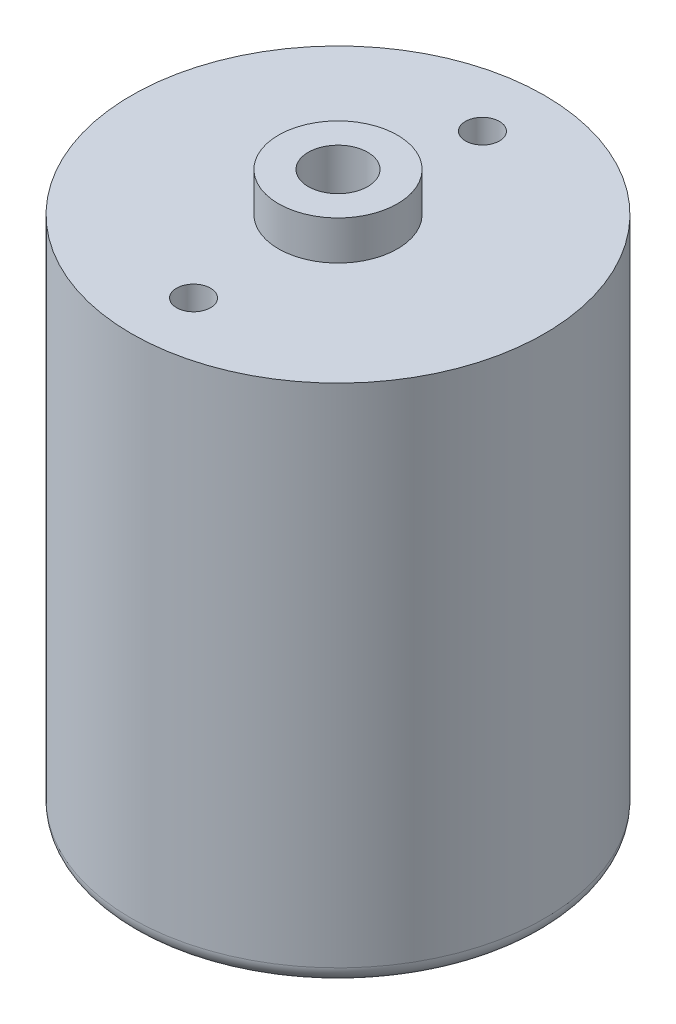
ISO-10303-21;
HEADER;
FILE_DESCRIPTION(('STEP AP214'),'2;1');
FILE_NAME('part.step','',(''),(''),'','','');
FILE_SCHEMA(('AUTOMOTIVE_DESIGN { 1 0 10303 214 1 1 1 1 }'));
ENDSEC;
DATA;
#1=APPLICATION_CONTEXT('core data for automotive mechanical design processes');
#2=APPLICATION_PROTOCOL_DEFINITION('international standard','automotive_design',2000,#1);
#3=PRODUCT_CONTEXT('',#1,'mechanical');
#4=PRODUCT('Part','Part','',(#3));
#5=PRODUCT_RELATED_PRODUCT_CATEGORY('part','',(#4));
#6=PRODUCT_DEFINITION_FORMATION('','',#4);
#7=PRODUCT_DEFINITION_CONTEXT('part definition',#1,'design');
#8=PRODUCT_DEFINITION('design','',#6,#7);
#9=PRODUCT_DEFINITION_SHAPE('','',#8);
#10=(LENGTH_UNIT() NAMED_UNIT(*) SI_UNIT(.MILLI.,.METRE.));
#11=(NAMED_UNIT(*) PLANE_ANGLE_UNIT() SI_UNIT($,.RADIAN.));
#12=(NAMED_UNIT(*) SI_UNIT($,.STERADIAN.) SOLID_ANGLE_UNIT());
#13=UNCERTAINTY_MEASURE_WITH_UNIT(LENGTH_MEASURE(1.E-05),#10,'distance_accuracy_value','');
#14=(GEOMETRIC_REPRESENTATION_CONTEXT(3) GLOBAL_UNCERTAINTY_ASSIGNED_CONTEXT((#13)) GLOBAL_UNIT_ASSIGNED_CONTEXT((#10,
#11,#12)) REPRESENTATION_CONTEXT('',''));
#15=CARTESIAN_POINT('',(0.,0.,0.));
#16=DIRECTION('',(0.,0.,1.));
#17=DIRECTION('',(1.,0.,0.));
#18=AXIS2_PLACEMENT_3D('',#15,#16,#17);
#19=CARTESIAN_POINT('',(0.,30.8,0.));
#20=DIRECTION('',(0.,-1.,0.));
#21=DIRECTION('',(0.,0.,-1.));
#22=AXIS2_PLACEMENT_3D('',#19,#20,#21);
#23=CYLINDRICAL_SURFACE('',#22,12.15);
#24=CARTESIAN_POINT('',(0.,1.,0.));
#25=DIRECTION('',(0.,1.,0.));
#26=DIRECTION('',(0.,0.,1.));
#27=AXIS2_PLACEMENT_3D('',#24,#25,#26);
#28=CIRCLE('',#27,12.15);
#29=CARTESIAN_POINT('',(0.,0.999999999999997,-12.15));
#30=VERTEX_POINT('',#29);
#31=EDGE_CURVE('E47',#30,#30,#28,.T.);
#32=CARTESIAN_POINT('',(0.,30.8,0.));
#33=DIRECTION('',(0.,1.,0.));
#34=DIRECTION('',(0.,0.,1.));
#35=AXIS2_PLACEMENT_3D('',#32,#33,#34);
#36=CIRCLE('',#35,12.15);
#37=CARTESIAN_POINT('',(0.,30.8,-12.15));
#38=VERTEX_POINT('',#37);
#39=EDGE_CURVE('E52',#38,#38,#36,.T.);
#40=CARTESIAN_POINT('',(0.,0.999999999999997,-12.15));
#41=CARTESIAN_POINT('',(0.,1.31041666666667,-12.15));
#42=CARTESIAN_POINT('',(0.,1.62083333333333,-12.15));
#43=CARTESIAN_POINT('',(0.,2.24166666666666,-12.15));
#44=CARTESIAN_POINT('',(0.,2.55208333333333,-12.15));
#45=CARTESIAN_POINT('',(0.,3.17291666666666,-12.15));
#46=CARTESIAN_POINT('',(0.,3.48333333333333,-12.15));
#47=CARTESIAN_POINT('',(0.,4.10416666666667,-12.15));
#48=CARTESIAN_POINT('',(0.,4.41458333333333,-12.15));
#49=CARTESIAN_POINT('',(0.,5.03541666666666,-12.15));
#50=CARTESIAN_POINT('',(0.,5.34583333333333,-12.15));
#51=CARTESIAN_POINT('',(0.,5.96666666666667,-12.15));
#52=CARTESIAN_POINT('',(0.,6.27708333333333,-12.15));
#53=CARTESIAN_POINT('',(0.,6.89791666666667,-12.15));
#54=CARTESIAN_POINT('',(0.,7.20833333333333,-12.15));
#55=CARTESIAN_POINT('',(0.,7.82916666666666,-12.15));
#56=CARTESIAN_POINT('',(0.,8.13958333333333,-12.15));
#57=CARTESIAN_POINT('',(0.,8.76041666666666,-12.15));
#58=CARTESIAN_POINT('',(0.,9.07083333333333,-12.15));
#59=CARTESIAN_POINT('',(0.,9.69166666666666,-12.15));
#60=CARTESIAN_POINT('',(0.,10.0020833333333,-12.15));
#61=CARTESIAN_POINT('',(0.,10.6229166666667,-12.15));
#62=CARTESIAN_POINT('',(0.,10.9333333333333,-12.15));
#63=CARTESIAN_POINT('',(0.,11.5541666666667,-12.15));
#64=CARTESIAN_POINT('',(0.,11.8645833333333,-12.15));
#65=CARTESIAN_POINT('',(0.,12.4854166666667,-12.15));
#66=CARTESIAN_POINT('',(0.,12.7958333333333,-12.15));
#67=CARTESIAN_POINT('',(0.,13.4166666666667,-12.15));
#68=CARTESIAN_POINT('',(0.,13.7270833333333,-12.15));
#69=CARTESIAN_POINT('',(0.,14.3479166666667,-12.15));
#70=CARTESIAN_POINT('',(0.,14.6583333333333,-12.15));
#71=CARTESIAN_POINT('',(0.,15.2791666666667,-12.15));
#72=CARTESIAN_POINT('',(0.,15.5895833333333,-12.15));
#73=CARTESIAN_POINT('',(0.,16.2104166666667,-12.15));
#74=CARTESIAN_POINT('',(0.,16.5208333333333,-12.15));
#75=CARTESIAN_POINT('',(0.,17.1416666666667,-12.15));
#76=CARTESIAN_POINT('',(0.,17.4520833333333,-12.15));
#77=CARTESIAN_POINT('',(0.,18.0729166666667,-12.15));
#78=CARTESIAN_POINT('',(0.,18.3833333333333,-12.15));
#79=CARTESIAN_POINT('',(0.,19.0041666666667,-12.15));
#80=CARTESIAN_POINT('',(0.,19.3145833333333,-12.15));
#81=CARTESIAN_POINT('',(0.,19.9354166666667,-12.15));
#82=CARTESIAN_POINT('',(0.,20.2458333333333,-12.15));
#83=CARTESIAN_POINT('',(0.,20.8666666666667,-12.15));
#84=CARTESIAN_POINT('',(0.,21.1770833333333,-12.15));
#85=CARTESIAN_POINT('',(0.,21.7979166666667,-12.15));
#86=CARTESIAN_POINT('',(0.,22.1083333333333,-12.15));
#87=CARTESIAN_POINT('',(0.,22.7291666666667,-12.15));
#88=CARTESIAN_POINT('',(0.,23.0395833333333,-12.15));
#89=CARTESIAN_POINT('',(0.,23.6604166666667,-12.15));
#90=CARTESIAN_POINT('',(0.,23.9708333333333,-12.15));
#91=CARTESIAN_POINT('',(0.,24.5916666666667,-12.15));
#92=CARTESIAN_POINT('',(0.,24.9020833333333,-12.15));
#93=CARTESIAN_POINT('',(0.,25.5229166666667,-12.15));
#94=CARTESIAN_POINT('',(0.,25.8333333333333,-12.15));
#95=CARTESIAN_POINT('',(0.,26.4541666666667,-12.15));
#96=CARTESIAN_POINT('',(0.,26.7645833333333,-12.15));
#97=CARTESIAN_POINT('',(0.,27.3854166666667,-12.15));
#98=CARTESIAN_POINT('',(0.,27.6958333333333,-12.15));
#99=CARTESIAN_POINT('',(0.,28.3166666666667,-12.15));
#100=CARTESIAN_POINT('',(0.,28.6270833333333,-12.15));
#101=CARTESIAN_POINT('',(0.,29.2479166666667,-12.15));
#102=CARTESIAN_POINT('',(0.,29.5583333333333,-12.15));
#103=CARTESIAN_POINT('',(0.,30.1791666666667,-12.15));
#104=CARTESIAN_POINT('',(0.,30.4895833333333,-12.15));
#105=CARTESIAN_POINT('',(0.,30.8,-12.15));
#106=B_SPLINE_CURVE_WITH_KNOTS('',3,(#40,#41,#42,#43,#44,#45,#46,#47,#48,#49,#50,#51,#52,#53,
#54,#55,#56,#57,#58,#59,#60,#61,#62,#63,#64,#65,#66,#67,#68,#69,#70,#71,#72,#73,#74,#75,#76,#77,
#78,#79,#80,#81,#82,#83,#84,#85,#86,#87,#88,#89,#90,#91,#92,#93,#94,#95,#96,#97,#98,#99,#100,
#101,#102,#103,#104,#105),.UNSPECIFIED.,.F.,.F.,(4,2,2,2,2,2,2,2,2,2,2,2,2,2,2,2,2,2,2,2,2,2,2,
2,2,2,2,2,2,2,2,2,4),(0.,0.931250000000001,1.8625,2.79375,3.725,4.65625,5.5875,6.51875,7.45,
8.38125,9.3125,10.24375,11.175,12.10625,13.0375,13.96875,14.9,15.83125,16.7625,17.69375,18.625,
19.55625,20.4875,21.41875,22.35,23.28125,24.2125,25.14375,26.075,27.00625,27.9375,28.86875,
29.8),.UNSPECIFIED.);
#107=EDGE_CURVE('BSEAM35',#30,#38,#106,.T.);
#108=ORIENTED_EDGE('',*,*,#31,.T.);
#109=ORIENTED_EDGE('',*,*,#39,.F.);
#110=ORIENTED_EDGE('',*,*,#107,.T.);
#111=ORIENTED_EDGE('',*,*,#107,.F.);
#112=EDGE_LOOP('',(#108,#110,#109,#111));
#113=FACE_BOUND('',#112,.T.);
#114=ADVANCED_FACE('F35',(#113),#23,.T.);
#115=CARTESIAN_POINT('',(0.,30.8,0.));
#116=DIRECTION('',(0.,1.,0.));
#117=DIRECTION('',(0.,0.,1.));
#118=AXIS2_PLACEMENT_3D('',#115,#116,#117);
#119=PLANE('',#118);
#120=CARTESIAN_POINT('',(0.,30.8,8.5));
#121=DIRECTION('',(0.,1.,0.));
#122=DIRECTION('',(0.,0.,1.));
#123=AXIS2_PLACEMENT_3D('',#120,#121,#122);
#124=CIRCLE('',#123,1.);
#125=CARTESIAN_POINT('',(0.,30.8,9.5));
#126=VERTEX_POINT('',#125);
#127=EDGE_CURVE('E104',#126,#126,#124,.T.);
#128=ORIENTED_EDGE('',*,*,#127,.F.);
#129=EDGE_LOOP('',(#128));
#130=FACE_BOUND('',#129,.T.);
#131=CARTESIAN_POINT('',(0.,30.8,-8.5));
#132=DIRECTION('',(0.,1.,0.));
#133=DIRECTION('',(0.,0.,1.));
#134=AXIS2_PLACEMENT_3D('',#131,#132,#133);
#135=CIRCLE('',#134,1.);
#136=CARTESIAN_POINT('',(0.,30.8,-7.5));
#137=VERTEX_POINT('',#136);
#138=EDGE_CURVE('E110',#137,#137,#135,.T.);
#139=ORIENTED_EDGE('',*,*,#138,.F.);
#140=EDGE_LOOP('',(#139));
#141=FACE_BOUND('',#140,.T.);
#142=CARTESIAN_POINT('',(0.,30.8,0.));
#143=DIRECTION('',(0.,1.,0.));
#144=DIRECTION('',(0.,0.,1.));
#145=AXIS2_PLACEMENT_3D('',#142,#143,#144);
#146=CIRCLE('',#145,3.5);
#147=CARTESIAN_POINT('',(0.,30.8,3.5));
#148=VERTEX_POINT('',#147);
#149=EDGE_CURVE('E10',#148,#148,#146,.T.);
#150=ORIENTED_EDGE('',*,*,#149,.F.);
#151=EDGE_LOOP('',(#150));
#152=FACE_BOUND('',#151,.T.);
#153=ORIENTED_EDGE('',*,*,#39,.T.);
#154=EDGE_LOOP('',(#153));
#155=FACE_BOUND('',#154,.T.);
#156=ADVANCED_FACE('F69',(#130,#141,#152,#155),#119,.T.);
#157=CARTESIAN_POINT('',(0.,0.,0.));
#158=DIRECTION('',(0.,1.,0.));
#159=DIRECTION('',(0.,0.,1.));
#160=AXIS2_PLACEMENT_3D('',#157,#158,#159);
#161=PLANE('',#160);
#162=CARTESIAN_POINT('',(0.,0.,0.));
#163=DIRECTION('',(0.,1.,0.));
#164=DIRECTION('',(0.,0.,1.));
#165=AXIS2_PLACEMENT_3D('',#162,#163,#164);
#166=CIRCLE('',#165,1.75);
#167=CARTESIAN_POINT('',(0.,0.,1.75));
#168=VERTEX_POINT('',#167);
#169=EDGE_CURVE('E99',#168,#168,#166,.T.);
#170=ORIENTED_EDGE('',*,*,#169,.T.);
#171=EDGE_LOOP('',(#170));
#172=FACE_BOUND('',#171,.T.);
#173=CARTESIAN_POINT('',(0.,0.,8.5));
#174=DIRECTION('',(0.,1.,0.));
#175=DIRECTION('',(0.,0.,1.));
#176=AXIS2_PLACEMENT_3D('',#173,#174,#175);
#177=CIRCLE('',#176,1.);
#178=CARTESIAN_POINT('',(0.,0.,9.5));
#179=VERTEX_POINT('',#178);
#180=EDGE_CURVE('E107',#179,#179,#177,.T.);
#181=ORIENTED_EDGE('',*,*,#180,.T.);
#182=EDGE_LOOP('',(#181));
#183=FACE_BOUND('',#182,.T.);
#184=CARTESIAN_POINT('',(0.,0.,-8.5));
#185=DIRECTION('',(0.,1.,0.));
#186=DIRECTION('',(0.,0.,1.));
#187=AXIS2_PLACEMENT_3D('',#184,#185,#186);
#188=CIRCLE('',#187,1.);
#189=CARTESIAN_POINT('',(0.,0.,-7.5));
#190=VERTEX_POINT('',#189);
#191=EDGE_CURVE('E113',#190,#190,#188,.T.);
#192=ORIENTED_EDGE('',*,*,#191,.T.);
#193=EDGE_LOOP('',(#192));
#194=FACE_BOUND('',#193,.T.);
#195=CARTESIAN_POINT('',(0.,0.,0.));
#196=DIRECTION('',(0.,1.,0.));
#197=DIRECTION('',(0.,0.,1.));
#198=AXIS2_PLACEMENT_3D('',#195,#196,#197);
#199=CIRCLE('',#198,11.15);
#200=CARTESIAN_POINT('',(0.,0.,11.15));
#201=VERTEX_POINT('',#200);
#202=EDGE_CURVE('E39',#201,#201,#199,.F.);
#203=ORIENTED_EDGE('',*,*,#202,.T.);
#204=EDGE_LOOP('',(#203));
#205=FACE_BOUND('',#204,.T.);
#206=ADVANCED_FACE('F61',(#172,#183,#194,#205),#161,.F.);
#207=CARTESIAN_POINT('',(0.,1.,0.));
#208=DIRECTION('',(0.,1.,0.));
#209=DIRECTION('',(0.,0.,1.));
#210=AXIS2_PLACEMENT_3D('',#207,#208,#209);
#211=TOROIDAL_SURFACE('',#210,11.15,1.);
#212=ORIENTED_EDGE('',*,*,#202,.F.);
#213=EDGE_LOOP('',(#212));
#214=FACE_BOUND('',#213,.T.);
#215=ORIENTED_EDGE('',*,*,#31,.F.);
#216=EDGE_LOOP('',(#215));
#217=FACE_BOUND('',#216,.T.);
#218=ADVANCED_FACE('F37',(#214,#217),#211,.T.);
#219=CARTESIAN_POINT('',(0.,0.,0.));
#220=DIRECTION('',(0.,1.,0.));
#221=DIRECTION('',(0.,0.,1.));
#222=AXIS2_PLACEMENT_3D('',#219,#220,#221);
#223=CYLINDRICAL_SURFACE('',#222,3.5);
#224=CARTESIAN_POINT('',(0.,33.1,0.));
#225=DIRECTION('',(0.,1.,0.));
#226=DIRECTION('',(0.,0.,1.));
#227=AXIS2_PLACEMENT_3D('',#224,#225,#226);
#228=CIRCLE('',#227,3.5);
#229=CARTESIAN_POINT('',(0.,33.1,3.5));
#230=VERTEX_POINT('',#229);
#231=EDGE_CURVE('E50',#230,#230,#228,.T.);
#232=CARTESIAN_POINT('',(0.,30.8,3.5));
#233=CARTESIAN_POINT('',(0.,30.8239583333333,3.5));
#234=CARTESIAN_POINT('',(0.,30.8479166666667,3.5));
#235=CARTESIAN_POINT('',(0.,30.8958333333333,3.5));
#236=CARTESIAN_POINT('',(0.,30.9197916666667,3.5));
#237=CARTESIAN_POINT('',(0.,30.9677083333333,3.5));
#238=CARTESIAN_POINT('',(0.,30.9916666666667,3.5));
#239=CARTESIAN_POINT('',(0.,31.0395833333333,3.5));
#240=CARTESIAN_POINT('',(0.,31.0635416666667,3.5));
#241=CARTESIAN_POINT('',(0.,31.1114583333333,3.5));
#242=CARTESIAN_POINT('',(0.,31.1354166666667,3.5));
#243=CARTESIAN_POINT('',(0.,31.1833333333333,3.5));
#244=CARTESIAN_POINT('',(0.,31.2072916666667,3.5));
#245=CARTESIAN_POINT('',(0.,31.2552083333333,3.5));
#246=CARTESIAN_POINT('',(0.,31.2791666666667,3.5));
#247=CARTESIAN_POINT('',(0.,31.3270833333333,3.5));
#248=CARTESIAN_POINT('',(0.,31.3510416666667,3.5));
#249=CARTESIAN_POINT('',(0.,31.3989583333333,3.5));
#250=CARTESIAN_POINT('',(0.,31.4229166666667,3.5));
#251=CARTESIAN_POINT('',(0.,31.4708333333333,3.5));
#252=CARTESIAN_POINT('',(0.,31.4947916666667,3.5));
#253=CARTESIAN_POINT('',(0.,31.5427083333333,3.5));
#254=CARTESIAN_POINT('',(0.,31.5666666666667,3.5));
#255=CARTESIAN_POINT('',(0.,31.6145833333333,3.5));
#256=CARTESIAN_POINT('',(0.,31.6385416666667,3.5));
#257=CARTESIAN_POINT('',(0.,31.6864583333333,3.5));
#258=CARTESIAN_POINT('',(0.,31.7104166666667,3.5));
#259=CARTESIAN_POINT('',(0.,31.7583333333333,3.5));
#260=CARTESIAN_POINT('',(0.,31.7822916666667,3.5));
#261=CARTESIAN_POINT('',(0.,31.8302083333333,3.5));
#262=CARTESIAN_POINT('',(0.,31.8541666666667,3.5));
#263=CARTESIAN_POINT('',(0.,31.9020833333333,3.5));
#264=CARTESIAN_POINT('',(0.,31.9260416666667,3.5));
#265=CARTESIAN_POINT('',(0.,31.9739583333333,3.5));
#266=CARTESIAN_POINT('',(0.,31.9979166666667,3.5));
#267=CARTESIAN_POINT('',(0.,32.0458333333333,3.5));
#268=CARTESIAN_POINT('',(0.,32.0697916666667,3.5));
#269=CARTESIAN_POINT('',(0.,32.1177083333333,3.5));
#270=CARTESIAN_POINT('',(0.,32.1416666666667,3.5));
#271=CARTESIAN_POINT('',(0.,32.1895833333333,3.5));
#272=CARTESIAN_POINT('',(0.,32.2135416666667,3.5));
#273=CARTESIAN_POINT('',(0.,32.2614583333333,3.5));
#274=CARTESIAN_POINT('',(0.,32.2854166666667,3.5));
#275=CARTESIAN_POINT('',(0.,32.3333333333333,3.5));
#276=CARTESIAN_POINT('',(0.,32.3572916666667,3.5));
#277=CARTESIAN_POINT('',(0.,32.4052083333333,3.5));
#278=CARTESIAN_POINT('',(0.,32.4291666666667,3.5));
#279=CARTESIAN_POINT('',(0.,32.4770833333333,3.5));
#280=CARTESIAN_POINT('',(0.,32.5010416666667,3.5));
#281=CARTESIAN_POINT('',(0.,32.5489583333333,3.5));
#282=CARTESIAN_POINT('',(0.,32.5729166666667,3.5));
#283=CARTESIAN_POINT('',(0.,32.6208333333333,3.5));
#284=CARTESIAN_POINT('',(0.,32.6447916666667,3.5));
#285=CARTESIAN_POINT('',(0.,32.6927083333333,3.5));
#286=CARTESIAN_POINT('',(0.,32.7166666666667,3.5));
#287=CARTESIAN_POINT('',(0.,32.7645833333333,3.5));
#288=CARTESIAN_POINT('',(0.,32.7885416666667,3.5));
#289=CARTESIAN_POINT('',(0.,32.8364583333333,3.5));
#290=CARTESIAN_POINT('',(0.,32.8604166666667,3.5));
#291=CARTESIAN_POINT('',(0.,32.9083333333333,3.5));
#292=CARTESIAN_POINT('',(0.,32.9322916666667,3.5));
#293=CARTESIAN_POINT('',(0.,32.9802083333333,3.5));
#294=CARTESIAN_POINT('',(0.,33.0041666666667,3.5));
#295=CARTESIAN_POINT('',(0.,33.0520833333333,3.5));
#296=CARTESIAN_POINT('',(0.,33.0760416666667,3.5));
#297=CARTESIAN_POINT('',(0.,33.1,3.5));
#298=B_SPLINE_CURVE_WITH_KNOTS('',3,(#232,#233,#234,#235,#236,#237,#238,#239,#240,#241,#242,
#243,#244,#245,#246,#247,#248,#249,#250,#251,#252,#253,#254,#255,#256,#257,#258,#259,#260,#261,
#262,#263,#264,#265,#266,#267,#268,#269,#270,#271,#272,#273,#274,#275,#276,#277,#278,#279,#280,
#281,#282,#283,#284,#285,#286,#287,#288,#289,#290,#291,#292,#293,#294,#295,#296,#297),
.UNSPECIFIED.,.F.,.F.,(4,2,2,2,2,2,2,2,2,2,2,2,2,2,2,2,2,2,2,2,2,2,2,2,2,2,2,2,2,2,2,2,4),(0.,
0.071874999999999,0.143750000000002,0.215625000000001,0.2875,0.359375000000002,
0.431250000000001,0.503124999999997,0.574999999999996,0.646874999999995,0.718750000000001,
0.790625,0.862499999999999,0.934374999999998,1.00625,1.078125,1.15,1.221875,1.29375,1.365625,
1.4375,1.509375,1.58125,1.653125,1.725,1.796875,1.86875,1.940625,2.0125,2.084375,2.15625,
2.228125,2.3),.UNSPECIFIED.);
#299=EDGE_CURVE('BSEAM60',#148,#230,#298,.T.);
#300=ORIENTED_EDGE('',*,*,#149,.T.);
#301=ORIENTED_EDGE('',*,*,#231,.F.);
#302=ORIENTED_EDGE('',*,*,#299,.T.);
#303=ORIENTED_EDGE('',*,*,#299,.F.);
#304=EDGE_LOOP('',(#300,#302,#301,#303));
#305=FACE_BOUND('',#304,.T.);
#306=ADVANCED_FACE('F60',(#305),#223,.T.);
#307=CARTESIAN_POINT('',(0.,33.1,0.));
#308=DIRECTION('',(0.,1.,0.));
#309=DIRECTION('',(0.,0.,1.));
#310=AXIS2_PLACEMENT_3D('',#307,#308,#309);
#311=PLANE('',#310);
#312=CARTESIAN_POINT('',(0.,33.1,0.));
#313=DIRECTION('',(0.,1.,0.));
#314=DIRECTION('',(0.,0.,1.));
#315=AXIS2_PLACEMENT_3D('',#312,#313,#314);
#316=CIRCLE('',#315,1.75);
#317=CARTESIAN_POINT('',(0.,33.1,1.75));
#318=VERTEX_POINT('',#317);
#319=EDGE_CURVE('E102',#318,#318,#316,.T.);
#320=ORIENTED_EDGE('',*,*,#319,.F.);
#321=EDGE_LOOP('',(#320));
#322=FACE_BOUND('',#321,.T.);
#323=ORIENTED_EDGE('',*,*,#231,.T.);
#324=EDGE_LOOP('',(#323));
#325=FACE_BOUND('',#324,.T.);
#326=ADVANCED_FACE('F67',(#322,#325),#311,.T.);
#327=CARTESIAN_POINT('',(0.,0.,-8.5));
#328=DIRECTION('',(0.,1.,0.));
#329=DIRECTION('',(0.,0.,1.));
#330=AXIS2_PLACEMENT_3D('',#327,#328,#329);
#331=CYLINDRICAL_SURFACE('',#330,1.);
#332=CARTESIAN_POINT('',(0.,0.,-7.5));
#333=CARTESIAN_POINT('',(0.,0.320833333333333,-7.5));
#334=CARTESIAN_POINT('',(0.,0.641666666666667,-7.5));
#335=CARTESIAN_POINT('',(0.,1.28333333333333,-7.5));
#336=CARTESIAN_POINT('',(0.,1.60416666666667,-7.5));
#337=CARTESIAN_POINT('',(0.,2.24583333333333,-7.5));
#338=CARTESIAN_POINT('',(0.,2.56666666666667,-7.5));
#339=CARTESIAN_POINT('',(0.,3.20833333333333,-7.5));
#340=CARTESIAN_POINT('',(0.,3.52916666666667,-7.5));
#341=CARTESIAN_POINT('',(0.,4.17083333333333,-7.5));
#342=CARTESIAN_POINT('',(0.,4.49166666666667,-7.5));
#343=CARTESIAN_POINT('',(0.,5.13333333333333,-7.5));
#344=CARTESIAN_POINT('',(0.,5.45416666666667,-7.5));
#345=CARTESIAN_POINT('',(0.,6.09583333333333,-7.5));
#346=CARTESIAN_POINT('',(0.,6.41666666666667,-7.5));
#347=CARTESIAN_POINT('',(0.,7.05833333333333,-7.5));
#348=CARTESIAN_POINT('',(0.,7.37916666666667,-7.5));
#349=CARTESIAN_POINT('',(0.,8.02083333333333,-7.5));
#350=CARTESIAN_POINT('',(0.,8.34166666666667,-7.5));
#351=CARTESIAN_POINT('',(0.,8.98333333333333,-7.5));
#352=CARTESIAN_POINT('',(0.,9.30416666666667,-7.5));
#353=CARTESIAN_POINT('',(0.,9.94583333333333,-7.5));
#354=CARTESIAN_POINT('',(0.,10.2666666666667,-7.5));
#355=CARTESIAN_POINT('',(0.,10.9083333333333,-7.5));
#356=CARTESIAN_POINT('',(0.,11.2291666666667,-7.5));
#357=CARTESIAN_POINT('',(0.,11.8708333333333,-7.5));
#358=CARTESIAN_POINT('',(0.,12.1916666666667,-7.5));
#359=CARTESIAN_POINT('',(0.,12.8333333333333,-7.5));
#360=CARTESIAN_POINT('',(0.,13.1541666666667,-7.5));
#361=CARTESIAN_POINT('',(0.,13.7958333333333,-7.5));
#362=CARTESIAN_POINT('',(0.,14.1166666666667,-7.5));
#363=CARTESIAN_POINT('',(0.,14.7583333333333,-7.5));
#364=CARTESIAN_POINT('',(0.,15.0791666666667,-7.5));
#365=CARTESIAN_POINT('',(0.,15.7208333333333,-7.5));
#366=CARTESIAN_POINT('',(0.,16.0416666666667,-7.5));
#367=CARTESIAN_POINT('',(0.,16.6833333333333,-7.5));
#368=CARTESIAN_POINT('',(0.,17.0041666666667,-7.5));
#369=CARTESIAN_POINT('',(0.,17.6458333333333,-7.5));
#370=CARTESIAN_POINT('',(0.,17.9666666666667,-7.5));
#371=CARTESIAN_POINT('',(0.,18.6083333333333,-7.5));
#372=CARTESIAN_POINT('',(0.,18.9291666666667,-7.5));
#373=CARTESIAN_POINT('',(0.,19.5708333333333,-7.5));
#374=CARTESIAN_POINT('',(0.,19.8916666666667,-7.5));
#375=CARTESIAN_POINT('',(0.,20.5333333333333,-7.5));
#376=CARTESIAN_POINT('',(0.,20.8541666666667,-7.5));
#377=CARTESIAN_POINT('',(0.,21.4958333333333,-7.5));
#378=CARTESIAN_POINT('',(0.,21.8166666666667,-7.5));
#379=CARTESIAN_POINT('',(0.,22.4583333333333,-7.5));
#380=CARTESIAN_POINT('',(0.,22.7791666666667,-7.5));
#381=CARTESIAN_POINT('',(0.,23.4208333333333,-7.5));
#382=CARTESIAN_POINT('',(0.,23.7416666666667,-7.5));
#383=CARTESIAN_POINT('',(0.,24.3833333333333,-7.5));
#384=CARTESIAN_POINT('',(0.,24.7041666666667,-7.5));
#385=CARTESIAN_POINT('',(0.,25.3458333333333,-7.5));
#386=CARTESIAN_POINT('',(0.,25.6666666666667,-7.5));
#387=CARTESIAN_POINT('',(0.,26.3083333333333,-7.5));
#388=CARTESIAN_POINT('',(0.,26.6291666666667,-7.5));
#389=CARTESIAN_POINT('',(0.,27.2708333333333,-7.5));
#390=CARTESIAN_POINT('',(0.,27.5916666666667,-7.5));
#391=CARTESIAN_POINT('',(0.,28.2333333333333,-7.5));
#392=CARTESIAN_POINT('',(0.,28.5541666666667,-7.5));
#393=CARTESIAN_POINT('',(0.,29.1958333333333,-7.5));
#394=CARTESIAN_POINT('',(0.,29.5166666666667,-7.5));
#395=CARTESIAN_POINT('',(0.,30.1583333333333,-7.5));
#396=CARTESIAN_POINT('',(0.,30.4791666666667,-7.5));
#397=CARTESIAN_POINT('',(0.,30.8,-7.5));
#398=B_SPLINE_CURVE_WITH_KNOTS('',3,(#332,#333,#334,#335,#336,#337,#338,#339,#340,#341,#342,
#343,#344,#345,#346,#347,#348,#349,#350,#351,#352,#353,#354,#355,#356,#357,#358,#359,#360,#361,
#362,#363,#364,#365,#366,#367,#368,#369,#370,#371,#372,#373,#374,#375,#376,#377,#378,#379,#380,
#381,#382,#383,#384,#385,#386,#387,#388,#389,#390,#391,#392,#393,#394,#395,#396,#397),
.UNSPECIFIED.,.F.,.F.,(4,2,2,2,2,2,2,2,2,2,2,2,2,2,2,2,2,2,2,2,2,2,2,2,2,2,2,2,2,2,2,2,4),(0.,
0.9625,1.925,2.8875,3.85,4.8125,5.775,6.7375,7.7,8.6625,9.625,10.5875,11.55,12.5125,13.475,
14.4375,15.4,16.3625,17.325,18.2875,19.25,20.2125,21.175,22.1375,23.1,24.0625,25.025,25.9875,
26.95,27.9125,28.875,29.8375,30.8),.UNSPECIFIED.);
#399=EDGE_CURVE('BSEAM82',#190,#137,#398,.T.);
#400=ORIENTED_EDGE('',*,*,#191,.F.);
#401=ORIENTED_EDGE('',*,*,#138,.T.);
#402=ORIENTED_EDGE('',*,*,#399,.T.);
#403=ORIENTED_EDGE('',*,*,#399,.F.);
#404=EDGE_LOOP('',(#400,#402,#401,#403));
#405=FACE_BOUND('',#404,.T.);
#406=ADVANCED_FACE('F82',(#405),#331,.F.);
#407=CARTESIAN_POINT('',(0.,0.,8.5));
#408=DIRECTION('',(0.,1.,0.));
#409=DIRECTION('',(0.,0.,1.));
#410=AXIS2_PLACEMENT_3D('',#407,#408,#409);
#411=CYLINDRICAL_SURFACE('',#410,1.);
#412=CARTESIAN_POINT('',(0.,0.,9.5));
#413=CARTESIAN_POINT('',(0.,0.320833333333333,9.5));
#414=CARTESIAN_POINT('',(0.,0.641666666666667,9.5));
#415=CARTESIAN_POINT('',(0.,1.28333333333333,9.5));
#416=CARTESIAN_POINT('',(0.,1.60416666666667,9.5));
#417=CARTESIAN_POINT('',(0.,2.24583333333333,9.5));
#418=CARTESIAN_POINT('',(0.,2.56666666666667,9.5));
#419=CARTESIAN_POINT('',(0.,3.20833333333333,9.5));
#420=CARTESIAN_POINT('',(0.,3.52916666666667,9.5));
#421=CARTESIAN_POINT('',(0.,4.17083333333333,9.5));
#422=CARTESIAN_POINT('',(0.,4.49166666666667,9.5));
#423=CARTESIAN_POINT('',(0.,5.13333333333333,9.5));
#424=CARTESIAN_POINT('',(0.,5.45416666666667,9.5));
#425=CARTESIAN_POINT('',(0.,6.09583333333333,9.5));
#426=CARTESIAN_POINT('',(0.,6.41666666666667,9.5));
#427=CARTESIAN_POINT('',(0.,7.05833333333333,9.5));
#428=CARTESIAN_POINT('',(0.,7.37916666666667,9.5));
#429=CARTESIAN_POINT('',(0.,8.02083333333333,9.5));
#430=CARTESIAN_POINT('',(0.,8.34166666666667,9.5));
#431=CARTESIAN_POINT('',(0.,8.98333333333333,9.5));
#432=CARTESIAN_POINT('',(0.,9.30416666666667,9.5));
#433=CARTESIAN_POINT('',(0.,9.94583333333333,9.5));
#434=CARTESIAN_POINT('',(0.,10.2666666666667,9.5));
#435=CARTESIAN_POINT('',(0.,10.9083333333333,9.5));
#436=CARTESIAN_POINT('',(0.,11.2291666666667,9.5));
#437=CARTESIAN_POINT('',(0.,11.8708333333333,9.5));
#438=CARTESIAN_POINT('',(0.,12.1916666666667,9.5));
#439=CARTESIAN_POINT('',(0.,12.8333333333333,9.5));
#440=CARTESIAN_POINT('',(0.,13.1541666666667,9.5));
#441=CARTESIAN_POINT('',(0.,13.7958333333333,9.5));
#442=CARTESIAN_POINT('',(0.,14.1166666666667,9.5));
#443=CARTESIAN_POINT('',(0.,14.7583333333333,9.5));
#444=CARTESIAN_POINT('',(0.,15.0791666666667,9.5));
#445=CARTESIAN_POINT('',(0.,15.7208333333333,9.5));
#446=CARTESIAN_POINT('',(0.,16.0416666666667,9.5));
#447=CARTESIAN_POINT('',(0.,16.6833333333333,9.5));
#448=CARTESIAN_POINT('',(0.,17.0041666666667,9.5));
#449=CARTESIAN_POINT('',(0.,17.6458333333333,9.5));
#450=CARTESIAN_POINT('',(0.,17.9666666666667,9.5));
#451=CARTESIAN_POINT('',(0.,18.6083333333333,9.5));
#452=CARTESIAN_POINT('',(0.,18.9291666666667,9.5));
#453=CARTESIAN_POINT('',(0.,19.5708333333333,9.5));
#454=CARTESIAN_POINT('',(0.,19.8916666666667,9.5));
#455=CARTESIAN_POINT('',(0.,20.5333333333333,9.5));
#456=CARTESIAN_POINT('',(0.,20.8541666666667,9.5));
#457=CARTESIAN_POINT('',(0.,21.4958333333333,9.5));
#458=CARTESIAN_POINT('',(0.,21.8166666666667,9.5));
#459=CARTESIAN_POINT('',(0.,22.4583333333333,9.5));
#460=CARTESIAN_POINT('',(0.,22.7791666666667,9.5));
#461=CARTESIAN_POINT('',(0.,23.4208333333333,9.5));
#462=CARTESIAN_POINT('',(0.,23.7416666666667,9.5));
#463=CARTESIAN_POINT('',(0.,24.3833333333333,9.5));
#464=CARTESIAN_POINT('',(0.,24.7041666666667,9.5));
#465=CARTESIAN_POINT('',(0.,25.3458333333333,9.5));
#466=CARTESIAN_POINT('',(0.,25.6666666666667,9.5));
#467=CARTESIAN_POINT('',(0.,26.3083333333333,9.5));
#468=CARTESIAN_POINT('',(0.,26.6291666666667,9.5));
#469=CARTESIAN_POINT('',(0.,27.2708333333333,9.5));
#470=CARTESIAN_POINT('',(0.,27.5916666666667,9.5));
#471=CARTESIAN_POINT('',(0.,28.2333333333333,9.5));
#472=CARTESIAN_POINT('',(0.,28.5541666666667,9.5));
#473=CARTESIAN_POINT('',(0.,29.1958333333333,9.5));
#474=CARTESIAN_POINT('',(0.,29.5166666666667,9.5));
#475=CARTESIAN_POINT('',(0.,30.1583333333333,9.5));
#476=CARTESIAN_POINT('',(0.,30.4791666666667,9.5));
#477=CARTESIAN_POINT('',(0.,30.8,9.5));
#478=B_SPLINE_CURVE_WITH_KNOTS('',3,(#412,#413,#414,#415,#416,#417,#418,#419,#420,#421,#422,
#423,#424,#425,#426,#427,#428,#429,#430,#431,#432,#433,#434,#435,#436,#437,#438,#439,#440,#441,
#442,#443,#444,#445,#446,#447,#448,#449,#450,#451,#452,#453,#454,#455,#456,#457,#458,#459,#460,
#461,#462,#463,#464,#465,#466,#467,#468,#469,#470,#471,#472,#473,#474,#475,#476,#477),
.UNSPECIFIED.,.F.,.F.,(4,2,2,2,2,2,2,2,2,2,2,2,2,2,2,2,2,2,2,2,2,2,2,2,2,2,2,2,2,2,2,2,4),(0.,
0.9625,1.925,2.8875,3.85,4.8125,5.775,6.7375,7.7,8.6625,9.625,10.5875,11.55,12.5125,13.475,
14.4375,15.4,16.3625,17.325,18.2875,19.25,20.2125,21.175,22.1375,23.1,24.0625,25.025,25.9875,
26.95,27.9125,28.875,29.8375,30.8),.UNSPECIFIED.);
#479=EDGE_CURVE('BSEAM86',#179,#126,#478,.T.);
#480=ORIENTED_EDGE('',*,*,#180,.F.);
#481=ORIENTED_EDGE('',*,*,#127,.T.);
#482=ORIENTED_EDGE('',*,*,#479,.T.);
#483=ORIENTED_EDGE('',*,*,#479,.F.);
#484=EDGE_LOOP('',(#480,#482,#481,#483));
#485=FACE_BOUND('',#484,.T.);
#486=ADVANCED_FACE('F86',(#485),#411,.F.);
#487=CARTESIAN_POINT('',(0.,0.,0.));
#488=DIRECTION('',(0.,1.,0.));
#489=DIRECTION('',(0.,0.,1.));
#490=AXIS2_PLACEMENT_3D('',#487,#488,#489);
#491=CYLINDRICAL_SURFACE('',#490,1.75);
#492=ORIENTED_EDGE('',*,*,#169,.F.);
#493=EDGE_LOOP('',(#492));
#494=FACE_BOUND('',#493,.T.);
#495=ORIENTED_EDGE('',*,*,#319,.T.);
#496=EDGE_LOOP('',(#495));
#497=FACE_BOUND('',#496,.T.);
#498=ADVANCED_FACE('F90',(#494,#497),#491,.F.);
#499=CLOSED_SHELL('',(#114,#156,#206,#218,#306,#326,#406,#486,#498));
#500=MANIFOLD_SOLID_BREP('B2',#499);
#501=ADVANCED_BREP_SHAPE_REPRESENTATION('',(#18,#500),#14);
#502=SHAPE_DEFINITION_REPRESENTATION(#9,#501);
ENDSEC;
END-ISO-10303-21;
